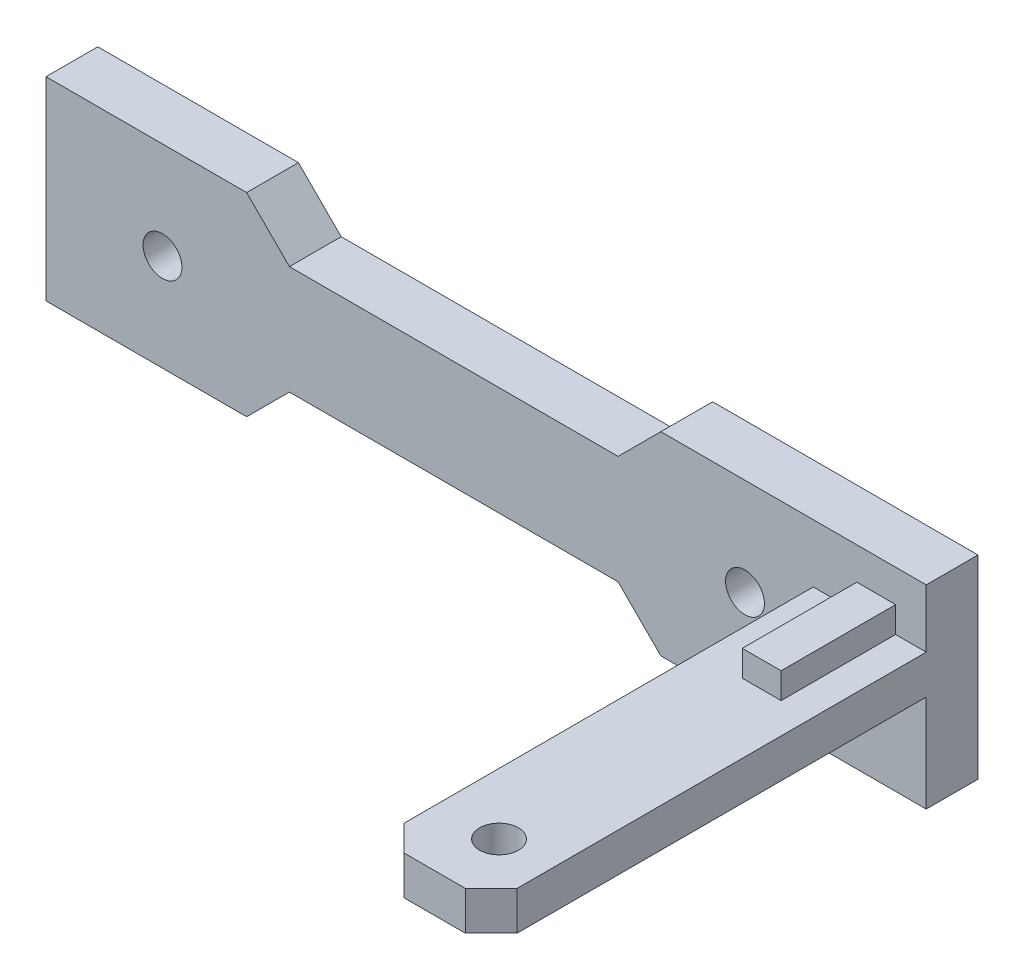
ISO-10303-21;
HEADER;
FILE_DESCRIPTION(('STEP AP214'),'2;1');
FILE_NAME('part.step','',(''),(''),'','','');
FILE_SCHEMA(('AUTOMOTIVE_DESIGN { 1 0 10303 214 1 1 1 1 }'));
ENDSEC;
DATA;
#1=APPLICATION_CONTEXT('core data for automotive mechanical design processes');
#2=APPLICATION_PROTOCOL_DEFINITION('international standard','automotive_design',2000,#1);
#3=PRODUCT_CONTEXT('',#1,'mechanical');
#4=PRODUCT('Part','Part','',(#3));
#5=PRODUCT_RELATED_PRODUCT_CATEGORY('part','',(#4));
#6=PRODUCT_DEFINITION_FORMATION('','',#4);
#7=PRODUCT_DEFINITION_CONTEXT('part definition',#1,'design');
#8=PRODUCT_DEFINITION('design','',#6,#7);
#9=PRODUCT_DEFINITION_SHAPE('','',#8);
#10=(LENGTH_UNIT() NAMED_UNIT(*) SI_UNIT(.MILLI.,.METRE.));
#11=(NAMED_UNIT(*) PLANE_ANGLE_UNIT() SI_UNIT($,.RADIAN.));
#12=(NAMED_UNIT(*) SI_UNIT($,.STERADIAN.) SOLID_ANGLE_UNIT());
#13=UNCERTAINTY_MEASURE_WITH_UNIT(LENGTH_MEASURE(1.E-05),#10,'distance_accuracy_value','');
#14=(GEOMETRIC_REPRESENTATION_CONTEXT(3) GLOBAL_UNCERTAINTY_ASSIGNED_CONTEXT((#13)) GLOBAL_UNIT_ASSIGNED_CONTEXT((#10,
#11,#12)) REPRESENTATION_CONTEXT('',''));
#15=CARTESIAN_POINT('',(0.,0.,0.));
#16=DIRECTION('',(0.,0.,1.));
#17=DIRECTION('',(1.,0.,0.));
#18=AXIS2_PLACEMENT_3D('',#15,#16,#17);
#19=CARTESIAN_POINT('',(0.,7.50106635036618,4.));
#20=DIRECTION('',(0.,-1.,0.));
#21=DIRECTION('',(1.,0.,0.));
#22=AXIS2_PLACEMENT_3D('',#19,#20,#21);
#23=PLANE('',#22);
#24=DIRECTION('',(0.,0.,1.));
#25=VECTOR('',#24,1.);
#26=CARTESIAN_POINT('',(15.9995146422342,7.50106635036618,-1.));
#27=LINE('',#26,#25);
#28=CARTESIAN_POINT('',(15.9995146422342,7.50106635036618,-1.));
#29=VERTEX_POINT('',#28);
#30=CARTESIAN_POINT('',(15.9995146422342,7.50106635036618,3.));
#31=VERTEX_POINT('',#30);
#32=EDGE_CURVE('E449',#29,#31,#27,.T.);
#33=ORIENTED_EDGE('',*,*,#32,.T.);
#34=DIRECTION('',(-1.,0.,0.));
#35=VECTOR('',#34,1.);
#36=CARTESIAN_POINT('',(36.5,7.50106635036618,3.));
#37=LINE('',#36,#35);
#38=CARTESIAN_POINT('',(36.5,7.50106635036618,3.));
#39=VERTEX_POINT('',#38);
#40=EDGE_CURVE('E385',#39,#31,#37,.T.);
#41=ORIENTED_EDGE('',*,*,#40,.F.);
#42=DIRECTION('',(0.,0.,1.));
#43=VECTOR('',#42,1.);
#44=CARTESIAN_POINT('',(36.5,7.50106635036618,0.));
#45=LINE('',#44,#43);
#46=CARTESIAN_POINT('',(36.5,7.50106635036618,-1.));
#47=VERTEX_POINT('',#46);
#48=EDGE_CURVE('E265',#47,#39,#45,.T.);
#49=ORIENTED_EDGE('',*,*,#48,.F.);
#50=DIRECTION('',(1.,0.,0.));
#51=VECTOR('',#50,1.);
#52=CARTESIAN_POINT('',(-31.5,7.50106635036618,-1.));
#53=LINE('',#52,#51);
#54=EDGE_CURVE('E249',#29,#47,#53,.T.);
#55=ORIENTED_EDGE('',*,*,#54,.F.);
#56=EDGE_LOOP('',(#33,#41,#49,#55));
#57=FACE_BOUND('',#56,.T.);
#58=ADVANCED_FACE('F43',(#57),#23,.F.);
#59=CARTESIAN_POINT('',(0.,-7.50106635036617,4.));
#60=DIRECTION('',(0.,-1.,0.));
#61=DIRECTION('',(1.,0.,0.));
#62=AXIS2_PLACEMENT_3D('',#59,#60,#61);
#63=PLANE('',#62);
#64=DIRECTION('',(-1.,0.,0.));
#65=VECTOR('',#64,1.);
#66=CARTESIAN_POINT('',(36.5,-7.50106635036617,-1.));
#67=LINE('',#66,#65);
#68=CARTESIAN_POINT('',(-15.9995146422342,-7.50106635036618,-1.));
#69=VERTEX_POINT('',#68);
#70=CARTESIAN_POINT('',(-31.5,-7.50106635036618,-1.));
#71=VERTEX_POINT('',#70);
#72=EDGE_CURVE('E420',#69,#71,#67,.T.);
#73=ORIENTED_EDGE('',*,*,#72,.F.);
#74=DIRECTION('',(0.,0.,1.));
#75=VECTOR('',#74,1.);
#76=CARTESIAN_POINT('',(-15.9995146422342,-7.50106635036618,-1.));
#77=LINE('',#76,#75);
#78=CARTESIAN_POINT('',(-15.9995146422342,-7.50106635036618,3.));
#79=VERTEX_POINT('',#78);
#80=EDGE_CURVE('E461',#69,#79,#77,.T.);
#81=ORIENTED_EDGE('',*,*,#80,.T.);
#82=DIRECTION('',(1.,0.,0.));
#83=VECTOR('',#82,1.);
#84=CARTESIAN_POINT('',(-31.5,-7.50106635036618,3.));
#85=LINE('',#84,#83);
#86=CARTESIAN_POINT('',(-31.5,-7.50106635036618,3.));
#87=VERTEX_POINT('',#86);
#88=EDGE_CURVE('E397',#87,#79,#85,.T.);
#89=ORIENTED_EDGE('',*,*,#88,.F.);
#90=DIRECTION('',(0.,0.,1.));
#91=VECTOR('',#90,1.);
#92=CARTESIAN_POINT('',(-31.5,-7.50106635036618,4.));
#93=LINE('',#92,#91);
#94=EDGE_CURVE('E284',#71,#87,#93,.T.);
#95=ORIENTED_EDGE('',*,*,#94,.F.);
#96=EDGE_LOOP('',(#73,#81,#89,#95));
#97=FACE_BOUND('',#96,.T.);
#98=ADVANCED_FACE('F436',(#97),#63,.T.);
#99=CARTESIAN_POINT('',(0.,0.,-1.));
#100=DIRECTION('',(0.,0.,-1.));
#101=DIRECTION('',(-1.,0.,0.));
#102=AXIS2_PLACEMENT_3D('',#99,#100,#101);
#103=PLANE('',#102);
#104=CARTESIAN_POINT('',(22.5,0.,-1.));
#105=DIRECTION('',(0.,0.,-1.));
#106=DIRECTION('',(-1.,0.,0.));
#107=AXIS2_PLACEMENT_3D('',#104,#105,#106);
#108=CIRCLE('',#107,1.5);
#109=CARTESIAN_POINT('',(21.,0.,-1.));
#110=VERTEX_POINT('',#109);
#111=EDGE_CURVE('E413',#110,#110,#108,.T.);
#112=ORIENTED_EDGE('',*,*,#111,.F.);
#113=EDGE_LOOP('',(#112));
#114=FACE_BOUND('',#113,.T.);
#115=CARTESIAN_POINT('',(-22.5,0.,-1.));
#116=DIRECTION('',(0.,0.,-1.));
#117=DIRECTION('',(-1.,0.,0.));
#118=AXIS2_PLACEMENT_3D('',#115,#116,#117);
#119=CIRCLE('',#118,1.5);
#120=CARTESIAN_POINT('',(-24.,0.,-1.));
#121=VERTEX_POINT('',#120);
#122=EDGE_CURVE('E409',#121,#121,#119,.T.);
#123=ORIENTED_EDGE('',*,*,#122,.F.);
#124=EDGE_LOOP('',(#123));
#125=FACE_BOUND('',#124,.T.);
#126=DIRECTION('',(-1.,0.,0.));
#127=VECTOR('',#126,1.);
#128=CARTESIAN_POINT('',(0.,4.19694569642091,-1.));
#129=LINE('',#128,#127);
#130=CARTESIAN_POINT('',(12.6953939882889,4.19694569642091,-1.));
#131=VERTEX_POINT('',#130);
#132=CARTESIAN_POINT('',(-12.6953939882889,4.1969456964209,-1.));
#133=VERTEX_POINT('',#132);
#134=EDGE_CURVE('E230',#131,#133,#129,.T.);
#135=ORIENTED_EDGE('',*,*,#134,.F.);
#136=DIRECTION('',(-0.707106781186542,-0.707106781186554,0.));
#137=VECTOR('',#136,1.);
#138=CARTESIAN_POINT('',(4.24922414593413,-4.24922414593405,-1.));
#139=LINE('',#138,#137);
#140=EDGE_CURVE('E241',#29,#131,#139,.T.);
#141=ORIENTED_EDGE('',*,*,#140,.F.);
#142=ORIENTED_EDGE('',*,*,#54,.T.);
#143=DIRECTION('',(0.,-1.,0.));
#144=VECTOR('',#143,1.);
#145=CARTESIAN_POINT('',(36.5,7.50106635036618,-1.));
#146=LINE('',#145,#144);
#147=CARTESIAN_POINT('',(36.5,-7.50106635036617,-1.));
#148=VERTEX_POINT('',#147);
#149=EDGE_CURVE('E417',#47,#148,#146,.T.);
#150=ORIENTED_EDGE('',*,*,#149,.T.);
#151=CARTESIAN_POINT('',(15.9995146422342,-7.50106635036618,-1.));
#152=VERTEX_POINT('',#151);
#153=EDGE_CURVE('E421',#148,#152,#67,.T.);
#154=ORIENTED_EDGE('',*,*,#153,.T.);
#155=DIRECTION('',(-0.707106781186542,0.707106781186554,0.));
#156=VECTOR('',#155,1.);
#157=CARTESIAN_POINT('',(4.24922414593413,4.24922414593405,-1.));
#158=LINE('',#157,#156);
#159=CARTESIAN_POINT('',(12.6953939882889,-4.19694569642091,-1.));
#160=VERTEX_POINT('',#159);
#161=EDGE_CURVE('E455',#152,#160,#158,.T.);
#162=ORIENTED_EDGE('',*,*,#161,.T.);
#163=DIRECTION('',(-1.,0.,0.));
#164=VECTOR('',#163,1.);
#165=CARTESIAN_POINT('',(0.,-4.19694569642091,-1.));
#166=LINE('',#165,#164);
#167=CARTESIAN_POINT('',(-12.6953939882889,-4.1969456964209,-1.));
#168=VERTEX_POINT('',#167);
#169=EDGE_CURVE('E458',#160,#168,#166,.T.);
#170=ORIENTED_EDGE('',*,*,#169,.T.);
#171=DIRECTION('',(0.707106781186542,0.707106781186554,0.));
#172=VECTOR('',#171,1.);
#173=CARTESIAN_POINT('',(-4.24922414593413,4.24922414593406,-1.));
#174=LINE('',#173,#172);
#175=EDGE_CURVE('E432',#69,#168,#174,.T.);
#176=ORIENTED_EDGE('',*,*,#175,.F.);
#177=ORIENTED_EDGE('',*,*,#72,.T.);
#178=DIRECTION('',(0.,1.,0.));
#179=VECTOR('',#178,1.);
#180=CARTESIAN_POINT('',(-31.5,-7.50106635036618,-1.));
#181=LINE('',#180,#179);
#182=CARTESIAN_POINT('',(-31.5,7.50106635036618,-1.));
#183=VERTEX_POINT('',#182);
#184=EDGE_CURVE('E246',#71,#183,#181,.T.);
#185=ORIENTED_EDGE('',*,*,#184,.T.);
#186=CARTESIAN_POINT('',(-15.9995146422342,7.50106635036618,-1.));
#187=VERTEX_POINT('',#186);
#188=EDGE_CURVE('E238',#183,#187,#53,.T.);
#189=ORIENTED_EDGE('',*,*,#188,.T.);
#190=DIRECTION('',(0.707106781186542,-0.707106781186554,0.));
#191=VECTOR('',#190,1.);
#192=CARTESIAN_POINT('',(-4.24922414593413,-4.24922414593406,-1.));
#193=LINE('',#192,#191);
#194=EDGE_CURVE('E219',#187,#133,#193,.T.);
#195=ORIENTED_EDGE('',*,*,#194,.T.);
#196=EDGE_LOOP('',(#135,#141,#142,#150,#154,#162,#170,#176,#177,#185,#189,#195));
#197=FACE_BOUND('',#196,.T.);
#198=ADVANCED_FACE('F244',(#114,#125,#197),#103,.T.);
#199=CARTESIAN_POINT('',(0.,0.,3.));
#200=DIRECTION('',(0.,0.,1.));
#201=DIRECTION('',(1.,0.,0.));
#202=AXIS2_PLACEMENT_3D('',#199,#200,#201);
#203=PLANE('',#202);
#204=CARTESIAN_POINT('',(22.5,0.,3.));
#205=DIRECTION('',(0.,0.,1.));
#206=DIRECTION('',(1.,0.,0.));
#207=AXIS2_PLACEMENT_3D('',#204,#205,#206);
#208=CIRCLE('',#207,1.5);
#209=CARTESIAN_POINT('',(24.,0.,3.));
#210=VERTEX_POINT('',#209);
#211=EDGE_CURVE('E405',#210,#210,#208,.T.);
#212=ORIENTED_EDGE('',*,*,#211,.F.);
#213=EDGE_LOOP('',(#212));
#214=FACE_BOUND('',#213,.T.);
#215=CARTESIAN_POINT('',(-22.5,0.,3.));
#216=DIRECTION('',(0.,0.,1.));
#217=DIRECTION('',(1.,0.,0.));
#218=AXIS2_PLACEMENT_3D('',#215,#216,#217);
#219=CIRCLE('',#218,1.5);
#220=CARTESIAN_POINT('',(-21.,0.,3.));
#221=VERTEX_POINT('',#220);
#222=EDGE_CURVE('E401',#221,#221,#219,.T.);
#223=ORIENTED_EDGE('',*,*,#222,.F.);
#224=EDGE_LOOP('',(#223));
#225=FACE_BOUND('',#224,.T.);
#226=ORIENTED_EDGE('',*,*,#40,.T.);
#227=DIRECTION('',(-0.707106781186542,-0.707106781186554,0.));
#228=VECTOR('',#227,1.);
#229=CARTESIAN_POINT('',(4.24922414593413,-4.24922414593405,3.));
#230=LINE('',#229,#228);
#231=CARTESIAN_POINT('',(12.6953939882889,4.19694569642091,3.));
#232=VERTEX_POINT('',#231);
#233=EDGE_CURVE('E325',#31,#232,#230,.T.);
#234=ORIENTED_EDGE('',*,*,#233,.T.);
#235=DIRECTION('',(-1.,0.,0.));
#236=VECTOR('',#235,1.);
#237=CARTESIAN_POINT('',(0.,4.19694569642091,3.));
#238=LINE('',#237,#236);
#239=CARTESIAN_POINT('',(-12.6953939882889,4.1969456964209,3.));
#240=VERTEX_POINT('',#239);
#241=EDGE_CURVE('E321',#232,#240,#238,.T.);
#242=ORIENTED_EDGE('',*,*,#241,.T.);
#243=DIRECTION('',(0.707106781186542,-0.707106781186554,0.));
#244=VECTOR('',#243,1.);
#245=CARTESIAN_POINT('',(-4.24922414593413,-4.24922414593406,3.));
#246=LINE('',#245,#244);
#247=CARTESIAN_POINT('',(-15.9995146422342,7.50106635036618,3.));
#248=VERTEX_POINT('',#247);
#249=EDGE_CURVE('E318',#248,#240,#246,.T.);
#250=ORIENTED_EDGE('',*,*,#249,.F.);
#251=CARTESIAN_POINT('',(-31.5,7.50106635036618,3.));
#252=VERTEX_POINT('',#251);
#253=EDGE_CURVE('E239',#248,#252,#37,.T.);
#254=ORIENTED_EDGE('',*,*,#253,.T.);
#255=DIRECTION('',(0.,-1.,0.));
#256=VECTOR('',#255,1.);
#257=CARTESIAN_POINT('',(-31.5,7.50106635036618,3.));
#258=LINE('',#257,#256);
#259=EDGE_CURVE('E393',#252,#87,#258,.T.);
#260=ORIENTED_EDGE('',*,*,#259,.T.);
#261=ORIENTED_EDGE('',*,*,#88,.T.);
#262=DIRECTION('',(0.707106781186542,0.707106781186554,0.));
#263=VECTOR('',#262,1.);
#264=CARTESIAN_POINT('',(-4.24922414593413,4.24922414593406,3.));
#265=LINE('',#264,#263);
#266=CARTESIAN_POINT('',(-12.6953939882889,-4.1969456964209,3.));
#267=VERTEX_POINT('',#266);
#268=EDGE_CURVE('E314',#79,#267,#265,.T.);
#269=ORIENTED_EDGE('',*,*,#268,.T.);
#270=DIRECTION('',(-1.,0.,0.));
#271=VECTOR('',#270,1.);
#272=CARTESIAN_POINT('',(0.,-4.19694569642091,3.));
#273=LINE('',#272,#271);
#274=CARTESIAN_POINT('',(12.6953939882889,-4.19694569642091,3.));
#275=VERTEX_POINT('',#274);
#276=EDGE_CURVE('E311',#275,#267,#273,.T.);
#277=ORIENTED_EDGE('',*,*,#276,.F.);
#278=DIRECTION('',(-0.707106781186542,0.707106781186554,0.));
#279=VECTOR('',#278,1.);
#280=CARTESIAN_POINT('',(4.24922414593413,4.24922414593405,3.));
#281=LINE('',#280,#279);
#282=CARTESIAN_POINT('',(15.9995146422342,-7.50106635036618,3.));
#283=VERTEX_POINT('',#282);
#284=EDGE_CURVE('E308',#283,#275,#281,.T.);
#285=ORIENTED_EDGE('',*,*,#284,.F.);
#286=CARTESIAN_POINT('',(36.5,-7.50106635036618,3.));
#287=VERTEX_POINT('',#286);
#288=EDGE_CURVE('E396',#283,#287,#85,.T.);
#289=ORIENTED_EDGE('',*,*,#288,.T.);
#290=DIRECTION('',(0.,1.,0.));
#291=VECTOR('',#290,1.);
#292=CARTESIAN_POINT('',(36.5,-7.50106635036618,3.));
#293=LINE('',#292,#291);
#294=CARTESIAN_POINT('',(36.5,0.,3.));
#295=VERTEX_POINT('',#294);
#296=EDGE_CURVE('E541',#287,#295,#293,.T.);
#297=ORIENTED_EDGE('',*,*,#296,.T.);
#298=DIRECTION('',(-1.,0.,0.));
#299=VECTOR('',#298,1.);
#300=CARTESIAN_POINT('',(36.5,0.,3.));
#301=LINE('',#300,#299);
#302=CARTESIAN_POINT('',(34.1370609738659,0.,3.));
#303=VERTEX_POINT('',#302);
#304=EDGE_CURVE('E546',#295,#303,#301,.T.);
#305=ORIENTED_EDGE('',*,*,#304,.T.);
#306=DIRECTION('',(0.,1.,0.));
#307=VECTOR('',#306,1.);
#308=CARTESIAN_POINT('',(34.1370609738659,0.,3.));
#309=LINE('',#308,#307);
#310=CARTESIAN_POINT('',(34.1370609738659,-2.,3.));
#311=VERTEX_POINT('',#310);
#312=EDGE_CURVE('E301',#311,#303,#309,.T.);
#313=ORIENTED_EDGE('',*,*,#312,.F.);
#314=DIRECTION('',(1.,0.,0.));
#315=VECTOR('',#314,1.);
#316=CARTESIAN_POINT('',(0.,-2.,3.));
#317=LINE('',#316,#315);
#318=CARTESIAN_POINT('',(31.1370609738659,-2.,3.));
#319=VERTEX_POINT('',#318);
#320=EDGE_CURVE('E482',#319,#311,#317,.T.);
#321=ORIENTED_EDGE('',*,*,#320,.F.);
#322=DIRECTION('',(0.,-1.,0.));
#323=VECTOR('',#322,1.);
#324=CARTESIAN_POINT('',(31.1370609738659,0.,3.));
#325=LINE('',#324,#323);
#326=CARTESIAN_POINT('',(31.1370609738659,0.,3.));
#327=VERTEX_POINT('',#326);
#328=EDGE_CURVE('E291',#327,#319,#325,.T.);
#329=ORIENTED_EDGE('',*,*,#328,.F.);
#330=CARTESIAN_POINT('',(27.7741219477318,0.,3.));
#331=VERTEX_POINT('',#330);
#332=EDGE_CURVE('E545',#327,#331,#301,.T.);
#333=ORIENTED_EDGE('',*,*,#332,.T.);
#334=DIRECTION('',(0.,1.,0.));
#335=VECTOR('',#334,1.);
#336=CARTESIAN_POINT('',(27.7741219477318,0.,3.));
#337=LINE('',#336,#335);
#338=CARTESIAN_POINT('',(27.7741219477318,3.,3.));
#339=VERTEX_POINT('',#338);
#340=EDGE_CURVE('E360',#331,#339,#337,.T.);
#341=ORIENTED_EDGE('',*,*,#340,.T.);
#342=DIRECTION('',(1.,0.,0.));
#343=VECTOR('',#342,1.);
#344=CARTESIAN_POINT('',(27.7741219477318,3.,3.));
#345=LINE('',#344,#343);
#346=CARTESIAN_POINT('',(31.1370609738659,3.,3.));
#347=VERTEX_POINT('',#346);
#348=EDGE_CURVE('E381',#339,#347,#345,.T.);
#349=ORIENTED_EDGE('',*,*,#348,.T.);
#350=DIRECTION('',(0.,-1.,0.));
#351=VECTOR('',#350,1.);
#352=CARTESIAN_POINT('',(31.1370609738659,5.,3.));
#353=LINE('',#352,#351);
#354=CARTESIAN_POINT('',(31.1370609738659,5.,3.));
#355=VERTEX_POINT('',#354);
#356=EDGE_CURVE('E517',#355,#347,#353,.T.);
#357=ORIENTED_EDGE('',*,*,#356,.F.);
#358=DIRECTION('',(1.,0.,0.));
#359=VECTOR('',#358,1.);
#360=CARTESIAN_POINT('',(0.,5.,3.));
#361=LINE('',#360,#359);
#362=CARTESIAN_POINT('',(34.1370609738659,5.,3.));
#363=VERTEX_POINT('',#362);
#364=EDGE_CURVE('E498',#355,#363,#361,.T.);
#365=ORIENTED_EDGE('',*,*,#364,.T.);
#366=DIRECTION('',(0.,-1.,0.));
#367=VECTOR('',#366,1.);
#368=CARTESIAN_POINT('',(34.1370609738659,5.,3.));
#369=LINE('',#368,#367);
#370=CARTESIAN_POINT('',(34.1370609738659,3.,3.));
#371=VERTEX_POINT('',#370);
#372=EDGE_CURVE('E513',#363,#371,#369,.T.);
#373=ORIENTED_EDGE('',*,*,#372,.T.);
#374=CARTESIAN_POINT('',(36.5,3.,3.));
#375=VERTEX_POINT('',#374);
#376=EDGE_CURVE('E388',#371,#375,#345,.T.);
#377=ORIENTED_EDGE('',*,*,#376,.T.);
#378=DIRECTION('',(0.,1.,0.));
#379=VECTOR('',#378,1.);
#380=CARTESIAN_POINT('',(36.5,3.,3.));
#381=LINE('',#380,#379);
#382=EDGE_CURVE('E374',#375,#39,#381,.T.);
#383=ORIENTED_EDGE('',*,*,#382,.T.);
#384=EDGE_LOOP('',(#226,#234,#242,#250,#254,#260,#261,#269,#277,#285,#289,#297,#305,#313,#321,
#329,#333,#341,#349,#357,#365,#373,#377,#383));
#385=FACE_BOUND('',#384,.T.);
#386=ADVANCED_FACE('F440',(#214,#225,#385),#203,.T.);
#387=ORIENTED_EDGE('',*,*,#253,.F.);
#388=DIRECTION('',(0.,0.,1.));
#389=VECTOR('',#388,1.);
#390=CARTESIAN_POINT('',(-15.9995146422342,7.50106635036618,-1.));
#391=LINE('',#390,#389);
#392=EDGE_CURVE('E222',#187,#248,#391,.T.);
#393=ORIENTED_EDGE('',*,*,#392,.F.);
#394=ORIENTED_EDGE('',*,*,#188,.F.);
#395=DIRECTION('',(0.,0.,1.));
#396=VECTOR('',#395,1.);
#397=CARTESIAN_POINT('',(-31.5,7.50106635036618,4.));
#398=LINE('',#397,#396);
#399=EDGE_CURVE('E288',#183,#252,#398,.T.);
#400=ORIENTED_EDGE('',*,*,#399,.T.);
#401=EDGE_LOOP('',(#387,#393,#394,#400));
#402=FACE_BOUND('',#401,.T.);
#403=ADVANCED_FACE('F236',(#402),#23,.F.);
#404=DIRECTION('',(0.,0.,1.));
#405=VECTOR('',#404,1.);
#406=CARTESIAN_POINT('',(15.9995146422342,-7.50106635036618,-1.));
#407=LINE('',#406,#405);
#408=EDGE_CURVE('E469',#152,#283,#407,.T.);
#409=ORIENTED_EDGE('',*,*,#408,.F.);
#410=ORIENTED_EDGE('',*,*,#153,.F.);
#411=DIRECTION('',(0.,0.,-1.));
#412=VECTOR('',#411,1.);
#413=CARTESIAN_POINT('',(36.5,-7.50106635036618,4.));
#414=LINE('',#413,#412);
#415=EDGE_CURVE('E281',#287,#148,#414,.T.);
#416=ORIENTED_EDGE('',*,*,#415,.F.);
#417=ORIENTED_EDGE('',*,*,#288,.F.);
#418=EDGE_LOOP('',(#409,#410,#416,#417));
#419=FACE_BOUND('',#418,.T.);
#420=ADVANCED_FACE('F588',(#419),#63,.T.);
#421=CARTESIAN_POINT('',(22.5,0.,4.));
#422=DIRECTION('',(0.,0.,-1.));
#423=DIRECTION('',(-1.,0.,0.));
#424=AXIS2_PLACEMENT_3D('',#421,#422,#423);
#425=CYLINDRICAL_SURFACE('',#424,1.5);
#426=ORIENTED_EDGE('',*,*,#111,.T.);
#427=EDGE_LOOP('',(#426));
#428=FACE_BOUND('',#427,.T.);
#429=ORIENTED_EDGE('',*,*,#211,.T.);
#430=EDGE_LOOP('',(#429));
#431=FACE_BOUND('',#430,.T.);
#432=ADVANCED_FACE('F595',(#428,#431),#425,.F.);
#433=CARTESIAN_POINT('',(-22.5,0.,4.));
#434=DIRECTION('',(0.,0.,-1.));
#435=DIRECTION('',(-1.,0.,0.));
#436=AXIS2_PLACEMENT_3D('',#433,#434,#435);
#437=CYLINDRICAL_SURFACE('',#436,1.5);
#438=ORIENTED_EDGE('',*,*,#122,.T.);
#439=EDGE_LOOP('',(#438));
#440=FACE_BOUND('',#439,.T.);
#441=ORIENTED_EDGE('',*,*,#222,.T.);
#442=EDGE_LOOP('',(#441));
#443=FACE_BOUND('',#442,.T.);
#444=ADVANCED_FACE('F623',(#440,#443),#437,.F.);
#445=CARTESIAN_POINT('',(-31.5,0.,0.));
#446=DIRECTION('',(1.,0.,0.));
#447=DIRECTION('',(0.,0.,-1.));
#448=AXIS2_PLACEMENT_3D('',#445,#446,#447);
#449=PLANE('',#448);
#450=ORIENTED_EDGE('',*,*,#259,.F.);
#451=ORIENTED_EDGE('',*,*,#399,.F.);
#452=ORIENTED_EDGE('',*,*,#184,.F.);
#453=ORIENTED_EDGE('',*,*,#94,.T.);
#454=EDGE_LOOP('',(#450,#451,#452,#453));
#455=FACE_BOUND('',#454,.T.);
#456=ADVANCED_FACE('F439',(#455),#449,.F.);
#457=CARTESIAN_POINT('',(36.5,0.,0.));
#458=DIRECTION('',(1.,0.,0.));
#459=DIRECTION('',(0.,0.,-1.));
#460=AXIS2_PLACEMENT_3D('',#457,#458,#459);
#461=PLANE('',#460);
#462=DIRECTION('',(0.,0.,1.));
#463=VECTOR('',#462,1.);
#464=CARTESIAN_POINT('',(36.5,3.,-5.22718525787011));
#465=LINE('',#464,#463);
#466=CARTESIAN_POINT('',(36.5,3.,34.6066176949041));
#467=VERTEX_POINT('',#466);
#468=EDGE_CURVE('E262',#375,#467,#465,.T.);
#469=ORIENTED_EDGE('',*,*,#468,.T.);
#470=DIRECTION('',(0.,-1.,0.));
#471=VECTOR('',#470,1.);
#472=CARTESIAN_POINT('',(36.5,0.,34.6066176949041));
#473=LINE('',#472,#471);
#474=CARTESIAN_POINT('',(36.5,0.,34.6066176949041));
#475=VERTEX_POINT('',#474);
#476=EDGE_CURVE('E11',#467,#475,#473,.T.);
#477=ORIENTED_EDGE('',*,*,#476,.T.);
#478=DIRECTION('',(0.,0.,1.));
#479=VECTOR('',#478,1.);
#480=CARTESIAN_POINT('',(36.5,0.,-5.22718525787011));
#481=LINE('',#480,#479);
#482=EDGE_CURVE('E266',#295,#475,#481,.T.);
#483=ORIENTED_EDGE('',*,*,#482,.F.);
#484=ORIENTED_EDGE('',*,*,#296,.F.);
#485=ORIENTED_EDGE('',*,*,#415,.T.);
#486=ORIENTED_EDGE('',*,*,#149,.F.);
#487=ORIENTED_EDGE('',*,*,#48,.T.);
#488=ORIENTED_EDGE('',*,*,#382,.F.);
#489=EDGE_LOOP('',(#469,#477,#483,#484,#485,#486,#487,#488));
#490=FACE_BOUND('',#489,.T.);
#491=ADVANCED_FACE('F373',(#490),#461,.T.);
#492=CARTESIAN_POINT('',(0.,0.,-5.22718525787011));
#493=DIRECTION('',(0.,-1.,0.));
#494=DIRECTION('',(0.,0.,-1.));
#495=AXIS2_PLACEMENT_3D('',#492,#493,#494);
#496=PLANE('',#495);
#497=DIRECTION('',(-1.,0.,0.));
#498=VECTOR('',#497,1.);
#499=CARTESIAN_POINT('',(0.,0.,36.6066176949041));
#500=LINE('',#499,#498);
#501=CARTESIAN_POINT('',(34.5,0.,36.6066176949041));
#502=VERTEX_POINT('',#501);
#503=CARTESIAN_POINT('',(29.7741219477318,0.,36.6066176949041));
#504=VERTEX_POINT('',#503);
#505=EDGE_CURVE('E254',#502,#504,#500,.T.);
#506=ORIENTED_EDGE('',*,*,#505,.T.);
#507=DIRECTION('',(0.707106781186549,0.,0.707106781186546));
#508=VECTOR('',#507,1.);
#509=CARTESIAN_POINT('',(-6.02984050252125,0.,0.802655244651163));
#510=LINE('',#509,#508);
#511=CARTESIAN_POINT('',(27.7741219477318,0.,34.6066176949041));
#512=VERTEX_POINT('',#511);
#513=EDGE_CURVE('E53',#504,#512,#510,.F.);
#514=ORIENTED_EDGE('',*,*,#513,.T.);
#515=DIRECTION('',(0.,0.,1.));
#516=VECTOR('',#515,1.);
#517=CARTESIAN_POINT('',(27.7741219477318,0.,-5.22718525787011));
#518=LINE('',#517,#516);
#519=EDGE_CURVE('E269',#331,#512,#518,.T.);
#520=ORIENTED_EDGE('',*,*,#519,.F.);
#521=ORIENTED_EDGE('',*,*,#332,.F.);
#522=DIRECTION('',(0.,0.,-1.));
#523=VECTOR('',#522,1.);
#524=CARTESIAN_POINT('',(31.1370609738659,0.,-5.22718525787011));
#525=LINE('',#524,#523);
#526=CARTESIAN_POINT('',(31.1370609738659,0.,11.8478215037108));
#527=VERTEX_POINT('',#526);
#528=EDGE_CURVE('E526',#527,#327,#525,.T.);
#529=ORIENTED_EDGE('',*,*,#528,.F.);
#530=DIRECTION('',(-1.,0.,0.));
#531=VECTOR('',#530,1.);
#532=CARTESIAN_POINT('',(0.,0.,11.8478215037108));
#533=LINE('',#532,#531);
#534=CARTESIAN_POINT('',(34.1370609738659,0.,11.8478215037108));
#535=VERTEX_POINT('',#534);
#536=EDGE_CURVE('E537',#535,#527,#533,.T.);
#537=ORIENTED_EDGE('',*,*,#536,.F.);
#538=DIRECTION('',(0.,0.,1.));
#539=VECTOR('',#538,1.);
#540=CARTESIAN_POINT('',(34.1370609738659,0.,-5.22718525787011));
#541=LINE('',#540,#539);
#542=EDGE_CURVE('E533',#303,#535,#541,.T.);
#543=ORIENTED_EDGE('',*,*,#542,.F.);
#544=ORIENTED_EDGE('',*,*,#304,.F.);
#545=ORIENTED_EDGE('',*,*,#482,.T.);
#546=DIRECTION('',(0.707106781186546,0.,-0.707106781186549));
#547=VECTOR('',#546,1.);
#548=CARTESIAN_POINT('',(38.1669014763872,0.,32.9397162185169));
#549=LINE('',#548,#547);
#550=EDGE_CURVE('E345',#475,#502,#549,.F.);
#551=ORIENTED_EDGE('',*,*,#550,.T.);
#552=EDGE_LOOP('',(#506,#514,#520,#521,#529,#537,#543,#544,#545,#551));
#553=FACE_BOUND('',#552,.T.);
#554=CARTESIAN_POINT('',(32.5,0.,32.));
#555=DIRECTION('',(0.,1.,0.));
#556=DIRECTION('',(0.,0.,1.));
#557=AXIS2_PLACEMENT_3D('',#554,#555,#556);
#558=CIRCLE('',#557,1.5);
#559=CARTESIAN_POINT('',(32.5,0.,33.5));
#560=VERTEX_POINT('',#559);
#561=EDGE_CURVE('E261',#560,#560,#558,.F.);
#562=ORIENTED_EDGE('',*,*,#561,.F.);
#563=EDGE_LOOP('',(#562));
#564=FACE_BOUND('',#563,.T.);
#565=ADVANCED_FACE('F351',(#553,#564),#496,.T.);
#566=CARTESIAN_POINT('',(0.,3.,-5.22718525787011));
#567=DIRECTION('',(0.,1.,0.));
#568=DIRECTION('',(0.,0.,1.));
#569=AXIS2_PLACEMENT_3D('',#566,#567,#568);
#570=PLANE('',#569);
#571=DIRECTION('',(0.,0.,1.));
#572=VECTOR('',#571,1.);
#573=CARTESIAN_POINT('',(27.7741219477318,3.,-5.22718525787011));
#574=LINE('',#573,#572);
#575=CARTESIAN_POINT('',(27.7741219477318,3.,34.6066176949041));
#576=VERTEX_POINT('',#575);
#577=EDGE_CURVE('E273',#339,#576,#574,.T.);
#578=ORIENTED_EDGE('',*,*,#577,.T.);
#579=DIRECTION('',(-0.707106781186549,0.,-0.707106781186546));
#580=VECTOR('',#579,1.);
#581=CARTESIAN_POINT('',(-6.02984050252125,3.,0.802655244651163));
#582=LINE('',#581,#580);
#583=CARTESIAN_POINT('',(29.7741219477318,3.,36.6066176949041));
#584=VERTEX_POINT('',#583);
#585=EDGE_CURVE('E336',#576,#584,#582,.F.);
#586=ORIENTED_EDGE('',*,*,#585,.T.);
#587=DIRECTION('',(1.,0.,0.));
#588=VECTOR('',#587,1.);
#589=CARTESIAN_POINT('',(0.,3.,36.6066176949041));
#590=LINE('',#589,#588);
#591=CARTESIAN_POINT('',(34.5,3.,36.6066176949041));
#592=VERTEX_POINT('',#591);
#593=EDGE_CURVE('E248',#584,#592,#590,.T.);
#594=ORIENTED_EDGE('',*,*,#593,.T.);
#595=DIRECTION('',(-0.707106781186546,0.,0.707106781186549));
#596=VECTOR('',#595,1.);
#597=CARTESIAN_POINT('',(38.1669014763872,3.,32.9397162185169));
#598=LINE('',#597,#596);
#599=EDGE_CURVE('E333',#592,#467,#598,.F.);
#600=ORIENTED_EDGE('',*,*,#599,.T.);
#601=ORIENTED_EDGE('',*,*,#468,.F.);
#602=ORIENTED_EDGE('',*,*,#376,.F.);
#603=DIRECTION('',(0.,0.,-1.));
#604=VECTOR('',#603,1.);
#605=CARTESIAN_POINT('',(34.1370609738659,3.,-5.22718525787011));
#606=LINE('',#605,#604);
#607=CARTESIAN_POINT('',(34.1370609738659,3.,11.8478215037108));
#608=VERTEX_POINT('',#607);
#609=EDGE_CURVE('E530',#608,#371,#606,.T.);
#610=ORIENTED_EDGE('',*,*,#609,.F.);
#611=DIRECTION('',(1.,0.,0.));
#612=VECTOR('',#611,1.);
#613=CARTESIAN_POINT('',(0.,3.,11.8478215037108));
#614=LINE('',#613,#612);
#615=CARTESIAN_POINT('',(31.1370609738659,3.,11.8478215037108));
#616=VERTEX_POINT('',#615);
#617=EDGE_CURVE('E305',#616,#608,#614,.T.);
#618=ORIENTED_EDGE('',*,*,#617,.F.);
#619=DIRECTION('',(0.,0.,1.));
#620=VECTOR('',#619,1.);
#621=CARTESIAN_POINT('',(31.1370609738659,3.,-5.22718525787011));
#622=LINE('',#621,#620);
#623=EDGE_CURVE('E511',#347,#616,#622,.T.);
#624=ORIENTED_EDGE('',*,*,#623,.F.);
#625=ORIENTED_EDGE('',*,*,#348,.F.);
#626=EDGE_LOOP('',(#578,#586,#594,#600,#601,#602,#610,#618,#624,#625));
#627=FACE_BOUND('',#626,.T.);
#628=CARTESIAN_POINT('',(32.5,3.,32.));
#629=DIRECTION('',(0.,1.,0.));
#630=DIRECTION('',(0.,0.,1.));
#631=AXIS2_PLACEMENT_3D('',#628,#629,#630);
#632=CIRCLE('',#631,1.5);
#633=CARTESIAN_POINT('',(32.5,3.,33.5));
#634=VERTEX_POINT('',#633);
#635=EDGE_CURVE('E277',#634,#634,#632,.T.);
#636=ORIENTED_EDGE('',*,*,#635,.F.);
#637=EDGE_LOOP('',(#636));
#638=FACE_BOUND('',#637,.T.);
#639=ADVANCED_FACE('F363',(#627,#638),#570,.T.);
#640=CARTESIAN_POINT('',(27.7741219477318,0.,-5.22718525787011));
#641=DIRECTION('',(-1.,0.,0.));
#642=DIRECTION('',(0.,0.,1.));
#643=AXIS2_PLACEMENT_3D('',#640,#641,#642);
#644=PLANE('',#643);
#645=ORIENTED_EDGE('',*,*,#519,.T.);
#646=DIRECTION('',(0.,1.,0.));
#647=VECTOR('',#646,1.);
#648=CARTESIAN_POINT('',(27.7741219477318,0.,34.6066176949041));
#649=LINE('',#648,#647);
#650=EDGE_CURVE('E329',#512,#576,#649,.T.);
#651=ORIENTED_EDGE('',*,*,#650,.T.);
#652=ORIENTED_EDGE('',*,*,#577,.F.);
#653=ORIENTED_EDGE('',*,*,#340,.F.);
#654=EDGE_LOOP('',(#645,#651,#652,#653));
#655=FACE_BOUND('',#654,.T.);
#656=ADVANCED_FACE('F358',(#655),#644,.T.);
#657=CARTESIAN_POINT('',(32.5,-7.50106635036618,32.));
#658=DIRECTION('',(0.,1.,0.));
#659=DIRECTION('',(0.,0.,1.));
#660=AXIS2_PLACEMENT_3D('',#657,#658,#659);
#661=CYLINDRICAL_SURFACE('',#660,1.5);
#662=ORIENTED_EDGE('',*,*,#561,.T.);
#663=EDGE_LOOP('',(#662));
#664=FACE_BOUND('',#663,.T.);
#665=ORIENTED_EDGE('',*,*,#635,.T.);
#666=EDGE_LOOP('',(#665));
#667=FACE_BOUND('',#666,.T.);
#668=ADVANCED_FACE('F609',(#664,#667),#661,.F.);
#669=CARTESIAN_POINT('',(0.,-7.50106635036618,36.6066176949041));
#670=DIRECTION('',(0.,0.,1.));
#671=DIRECTION('',(1.,0.,0.));
#672=AXIS2_PLACEMENT_3D('',#669,#670,#671);
#673=PLANE('',#672);
#674=ORIENTED_EDGE('',*,*,#593,.F.);
#675=DIRECTION('',(0.,-1.,0.));
#676=VECTOR('',#675,1.);
#677=CARTESIAN_POINT('',(29.7741219477318,-7.50106635036618,36.6066176949041));
#678=LINE('',#677,#676);
#679=EDGE_CURVE('E66',#584,#504,#678,.T.);
#680=ORIENTED_EDGE('',*,*,#679,.T.);
#681=ORIENTED_EDGE('',*,*,#505,.F.);
#682=DIRECTION('',(0.,1.,0.));
#683=VECTOR('',#682,1.);
#684=CARTESIAN_POINT('',(34.5,-7.50106635036618,36.6066176949041));
#685=LINE('',#684,#683);
#686=EDGE_CURVE('E339',#502,#592,#685,.T.);
#687=ORIENTED_EDGE('',*,*,#686,.T.);
#688=EDGE_LOOP('',(#674,#680,#681,#687));
#689=FACE_BOUND('',#688,.T.);
#690=ADVANCED_FACE('F366',(#689),#673,.T.);
#691=CARTESIAN_POINT('',(0.,-2.,0.));
#692=DIRECTION('',(0.,-1.,0.));
#693=DIRECTION('',(0.,0.,-1.));
#694=AXIS2_PLACEMENT_3D('',#691,#692,#693);
#695=PLANE('',#694);
#696=DIRECTION('',(-1.,0.,0.));
#697=VECTOR('',#696,1.);
#698=CARTESIAN_POINT('',(0.,-2.,11.8478215037108));
#699=LINE('',#698,#697);
#700=CARTESIAN_POINT('',(34.1370609738659,-2.,11.8478215037108));
#701=VERTEX_POINT('',#700);
#702=CARTESIAN_POINT('',(31.1370609738659,-2.,11.8478215037108));
#703=VERTEX_POINT('',#702);
#704=EDGE_CURVE('E474',#701,#703,#699,.T.);
#705=ORIENTED_EDGE('',*,*,#704,.T.);
#706=DIRECTION('',(0.,0.,-1.));
#707=VECTOR('',#706,1.);
#708=CARTESIAN_POINT('',(31.1370609738659,-2.,0.));
#709=LINE('',#708,#707);
#710=EDGE_CURVE('E478',#703,#319,#709,.T.);
#711=ORIENTED_EDGE('',*,*,#710,.T.);
#712=ORIENTED_EDGE('',*,*,#320,.T.);
#713=DIRECTION('',(0.,0.,1.));
#714=VECTOR('',#713,1.);
#715=CARTESIAN_POINT('',(34.1370609738659,-2.,0.));
#716=LINE('',#715,#714);
#717=EDGE_CURVE('E486',#311,#701,#716,.T.);
#718=ORIENTED_EDGE('',*,*,#717,.T.);
#719=EDGE_LOOP('',(#705,#711,#712,#718));
#720=FACE_BOUND('',#719,.T.);
#721=ADVANCED_FACE('F579',(#720),#695,.T.);
#722=CARTESIAN_POINT('',(31.1370609738659,5.,0.));
#723=DIRECTION('',(-1.,0.,0.));
#724=DIRECTION('',(0.,0.,1.));
#725=AXIS2_PLACEMENT_3D('',#722,#723,#724);
#726=PLANE('',#725);
#727=DIRECTION('',(0.,-1.,0.));
#728=VECTOR('',#727,1.);
#729=CARTESIAN_POINT('',(31.1370609738659,5.,11.8478215037108));
#730=LINE('',#729,#728);
#731=EDGE_CURVE('E506',#527,#703,#730,.T.);
#732=ORIENTED_EDGE('',*,*,#731,.F.);
#733=ORIENTED_EDGE('',*,*,#528,.T.);
#734=ORIENTED_EDGE('',*,*,#328,.T.);
#735=ORIENTED_EDGE('',*,*,#710,.F.);
#736=EDGE_LOOP('',(#732,#733,#734,#735));
#737=FACE_BOUND('',#736,.T.);
#738=ADVANCED_FACE('F568',(#737),#726,.T.);
#739=CARTESIAN_POINT('',(34.1370609738659,5.,0.));
#740=DIRECTION('',(1.,0.,0.));
#741=DIRECTION('',(0.,0.,-1.));
#742=AXIS2_PLACEMENT_3D('',#739,#740,#741);
#743=PLANE('',#742);
#744=ORIENTED_EDGE('',*,*,#312,.T.);
#745=ORIENTED_EDGE('',*,*,#542,.T.);
#746=DIRECTION('',(0.,-1.,0.));
#747=VECTOR('',#746,1.);
#748=CARTESIAN_POINT('',(34.1370609738659,5.,11.8478215037108));
#749=LINE('',#748,#747);
#750=EDGE_CURVE('E512',#535,#701,#749,.T.);
#751=ORIENTED_EDGE('',*,*,#750,.T.);
#752=ORIENTED_EDGE('',*,*,#717,.F.);
#753=EDGE_LOOP('',(#744,#745,#751,#752));
#754=FACE_BOUND('',#753,.T.);
#755=ADVANCED_FACE('F576',(#754),#743,.T.);
#756=CARTESIAN_POINT('',(0.,5.,11.8478215037108));
#757=DIRECTION('',(0.,0.,1.));
#758=DIRECTION('',(1.,0.,0.));
#759=AXIS2_PLACEMENT_3D('',#756,#757,#758);
#760=PLANE('',#759);
#761=ORIENTED_EDGE('',*,*,#750,.F.);
#762=ORIENTED_EDGE('',*,*,#536,.T.);
#763=ORIENTED_EDGE('',*,*,#731,.T.);
#764=ORIENTED_EDGE('',*,*,#704,.F.);
#765=EDGE_LOOP('',(#761,#762,#763,#764));
#766=FACE_BOUND('',#765,.T.);
#767=ADVANCED_FACE('F690',(#766),#760,.T.);
#768=CARTESIAN_POINT('',(31.1370609738659,5.,11.8478215037108));
#769=VERTEX_POINT('',#768);
#770=EDGE_CURVE('E520',#769,#616,#730,.T.);
#771=ORIENTED_EDGE('',*,*,#770,.T.);
#772=ORIENTED_EDGE('',*,*,#617,.T.);
#773=CARTESIAN_POINT('',(34.1370609738659,5.,11.8478215037108));
#774=VERTEX_POINT('',#773);
#775=EDGE_CURVE('E507',#774,#608,#749,.T.);
#776=ORIENTED_EDGE('',*,*,#775,.F.);
#777=DIRECTION('',(-1.,0.,0.));
#778=VECTOR('',#777,1.);
#779=CARTESIAN_POINT('',(0.,5.,11.8478215037108));
#780=LINE('',#779,#778);
#781=EDGE_CURVE('E490',#774,#769,#780,.T.);
#782=ORIENTED_EDGE('',*,*,#781,.T.);
#783=EDGE_LOOP('',(#771,#772,#776,#782));
#784=FACE_BOUND('',#783,.T.);
#785=ADVANCED_FACE('F559',(#784),#760,.T.);
#786=ORIENTED_EDGE('',*,*,#775,.T.);
#787=ORIENTED_EDGE('',*,*,#609,.T.);
#788=ORIENTED_EDGE('',*,*,#372,.F.);
#789=DIRECTION('',(0.,0.,1.));
#790=VECTOR('',#789,1.);
#791=CARTESIAN_POINT('',(34.1370609738659,5.,0.));
#792=LINE('',#791,#790);
#793=EDGE_CURVE('E502',#363,#774,#792,.T.);
#794=ORIENTED_EDGE('',*,*,#793,.T.);
#795=EDGE_LOOP('',(#786,#787,#788,#794));
#796=FACE_BOUND('',#795,.T.);
#797=ADVANCED_FACE('F556',(#796),#743,.T.);
#798=ORIENTED_EDGE('',*,*,#356,.T.);
#799=ORIENTED_EDGE('',*,*,#623,.T.);
#800=ORIENTED_EDGE('',*,*,#770,.F.);
#801=DIRECTION('',(0.,0.,-1.));
#802=VECTOR('',#801,1.);
#803=CARTESIAN_POINT('',(31.1370609738659,5.,0.));
#804=LINE('',#803,#802);
#805=EDGE_CURVE('E494',#769,#355,#804,.T.);
#806=ORIENTED_EDGE('',*,*,#805,.T.);
#807=EDGE_LOOP('',(#798,#799,#800,#806));
#808=FACE_BOUND('',#807,.T.);
#809=ADVANCED_FACE('F565',(#808),#726,.T.);
#810=CARTESIAN_POINT('',(0.,5.,0.));
#811=DIRECTION('',(0.,-1.,0.));
#812=DIRECTION('',(0.,0.,-1.));
#813=AXIS2_PLACEMENT_3D('',#810,#811,#812);
#814=PLANE('',#813);
#815=ORIENTED_EDGE('',*,*,#781,.F.);
#816=ORIENTED_EDGE('',*,*,#793,.F.);
#817=ORIENTED_EDGE('',*,*,#364,.F.);
#818=ORIENTED_EDGE('',*,*,#805,.F.);
#819=EDGE_LOOP('',(#815,#816,#817,#818));
#820=FACE_BOUND('',#819,.T.);
#821=ADVANCED_FACE('F562',(#820),#814,.F.);
#822=CARTESIAN_POINT('',(-4.24922414593413,4.24922414593406,-1.));
#823=DIRECTION('',(0.707106781186554,-0.707106781186542,0.));
#824=DIRECTION('',(0.707106781186542,0.707106781186554,0.));
#825=AXIS2_PLACEMENT_3D('',#822,#823,#824);
#826=PLANE('',#825);
#827=ORIENTED_EDGE('',*,*,#80,.F.);
#828=ORIENTED_EDGE('',*,*,#175,.T.);
#829=DIRECTION('',(0.,0.,1.));
#830=VECTOR('',#829,1.);
#831=CARTESIAN_POINT('',(-12.6953939882889,-4.1969456964209,-1.));
#832=LINE('',#831,#830);
#833=EDGE_CURVE('E231',#168,#267,#832,.T.);
#834=ORIENTED_EDGE('',*,*,#833,.T.);
#835=ORIENTED_EDGE('',*,*,#268,.F.);
#836=EDGE_LOOP('',(#827,#828,#834,#835));
#837=FACE_BOUND('',#836,.T.);
#838=ADVANCED_FACE('F573',(#837),#826,.T.);
#839=CARTESIAN_POINT('',(0.,-4.19694569642091,-1.));
#840=DIRECTION('',(0.,1.,0.));
#841=DIRECTION('',(-1.,0.,0.));
#842=AXIS2_PLACEMENT_3D('',#839,#840,#841);
#843=PLANE('',#842);
#844=ORIENTED_EDGE('',*,*,#276,.T.);
#845=ORIENTED_EDGE('',*,*,#833,.F.);
#846=ORIENTED_EDGE('',*,*,#169,.F.);
#847=DIRECTION('',(0.,0.,1.));
#848=VECTOR('',#847,1.);
#849=CARTESIAN_POINT('',(12.6953939882889,-4.19694569642091,-1.));
#850=LINE('',#849,#848);
#851=EDGE_CURVE('E465',#160,#275,#850,.T.);
#852=ORIENTED_EDGE('',*,*,#851,.T.);
#853=EDGE_LOOP('',(#844,#845,#846,#852));
#854=FACE_BOUND('',#853,.T.);
#855=ADVANCED_FACE('F760',(#854),#843,.F.);
#856=CARTESIAN_POINT('',(4.24922414593413,4.24922414593405,-1.));
#857=DIRECTION('',(0.707106781186554,0.707106781186542,0.));
#858=DIRECTION('',(-0.707106781186542,0.707106781186554,0.));
#859=AXIS2_PLACEMENT_3D('',#856,#857,#858);
#860=PLANE('',#859);
#861=ORIENTED_EDGE('',*,*,#284,.T.);
#862=ORIENTED_EDGE('',*,*,#851,.F.);
#863=ORIENTED_EDGE('',*,*,#161,.F.);
#864=ORIENTED_EDGE('',*,*,#408,.T.);
#865=EDGE_LOOP('',(#861,#862,#863,#864));
#866=FACE_BOUND('',#865,.T.);
#867=ADVANCED_FACE('F770',(#866),#860,.F.);
#868=CARTESIAN_POINT('',(4.24922414593413,-4.24922414593405,-1.));
#869=DIRECTION('',(-0.707106781186554,0.707106781186542,0.));
#870=DIRECTION('',(-0.707106781186542,-0.707106781186554,0.));
#871=AXIS2_PLACEMENT_3D('',#868,#869,#870);
#872=PLANE('',#871);
#873=ORIENTED_EDGE('',*,*,#32,.F.);
#874=ORIENTED_EDGE('',*,*,#140,.T.);
#875=DIRECTION('',(0.,0.,1.));
#876=VECTOR('',#875,1.);
#877=CARTESIAN_POINT('',(12.6953939882889,4.19694569642091,-1.));
#878=LINE('',#877,#876);
#879=EDGE_CURVE('E446',#131,#232,#878,.T.);
#880=ORIENTED_EDGE('',*,*,#879,.T.);
#881=ORIENTED_EDGE('',*,*,#233,.F.);
#882=EDGE_LOOP('',(#873,#874,#880,#881));
#883=FACE_BOUND('',#882,.T.);
#884=ADVANCED_FACE('F780',(#883),#872,.T.);
#885=CARTESIAN_POINT('',(0.,4.19694569642091,-1.));
#886=DIRECTION('',(0.,1.,0.));
#887=DIRECTION('',(-1.,0.,0.));
#888=AXIS2_PLACEMENT_3D('',#885,#886,#887);
#889=PLANE('',#888);
#890=ORIENTED_EDGE('',*,*,#879,.F.);
#891=ORIENTED_EDGE('',*,*,#134,.T.);
#892=DIRECTION('',(0.,0.,1.));
#893=VECTOR('',#892,1.);
#894=CARTESIAN_POINT('',(-12.6953939882889,4.1969456964209,-1.));
#895=LINE('',#894,#893);
#896=EDGE_CURVE('E225',#133,#240,#895,.T.);
#897=ORIENTED_EDGE('',*,*,#896,.T.);
#898=ORIENTED_EDGE('',*,*,#241,.F.);
#899=EDGE_LOOP('',(#890,#891,#897,#898));
#900=FACE_BOUND('',#899,.T.);
#901=ADVANCED_FACE('F443',(#900),#889,.T.);
#902=CARTESIAN_POINT('',(-4.24922414593413,-4.24922414593406,-1.));
#903=DIRECTION('',(-0.707106781186554,-0.707106781186542,0.));
#904=DIRECTION('',(0.707106781186542,-0.707106781186554,0.));
#905=AXIS2_PLACEMENT_3D('',#902,#903,#904);
#906=PLANE('',#905);
#907=ORIENTED_EDGE('',*,*,#249,.T.);
#908=ORIENTED_EDGE('',*,*,#896,.F.);
#909=ORIENTED_EDGE('',*,*,#194,.F.);
#910=ORIENTED_EDGE('',*,*,#392,.T.);
#911=EDGE_LOOP('',(#907,#908,#909,#910));
#912=FACE_BOUND('',#911,.T.);
#913=ADVANCED_FACE('F221',(#912),#906,.F.);
#914=CARTESIAN_POINT('',(27.7741219477318,0.,34.6066176949041));
#915=DIRECTION('',(0.707106781186546,0.,-0.707106781186549));
#916=DIRECTION('',(0.,1.,0.));
#917=AXIS2_PLACEMENT_3D('',#914,#915,#916);
#918=PLANE('',#917);
#919=ORIENTED_EDGE('',*,*,#513,.F.);
#920=ORIENTED_EDGE('',*,*,#679,.F.);
#921=ORIENTED_EDGE('',*,*,#585,.F.);
#922=ORIENTED_EDGE('',*,*,#650,.F.);
#923=EDGE_LOOP('',(#919,#920,#921,#922));
#924=FACE_BOUND('',#923,.T.);
#925=ADVANCED_FACE('F361',(#924),#918,.F.);
#926=CARTESIAN_POINT('',(34.5,-7.50106635036618,36.6066176949041));
#927=DIRECTION('',(-0.707106781186549,0.,-0.707106781186546));
#928=DIRECTION('',(0.,1.,0.));
#929=AXIS2_PLACEMENT_3D('',#926,#927,#928);
#930=PLANE('',#929);
#931=ORIENTED_EDGE('',*,*,#550,.F.);
#932=ORIENTED_EDGE('',*,*,#476,.F.);
#933=ORIENTED_EDGE('',*,*,#599,.F.);
#934=ORIENTED_EDGE('',*,*,#686,.F.);
#935=EDGE_LOOP('',(#931,#932,#933,#934));
#936=FACE_BOUND('',#935,.T.);
#937=ADVANCED_FACE('F46',(#936),#930,.F.);
#938=CLOSED_SHELL('',(#58,#98,#198,#386,#403,#420,#432,#444,#456,#491,#565,#639,#656,#668,#690,
#721,#738,#755,#767,#785,#797,#809,#821,#838,#855,#867,#884,#901,#913,#925,#937));
#939=MANIFOLD_SOLID_BREP('B2',#938);
#940=ADVANCED_BREP_SHAPE_REPRESENTATION('',(#18,#939),#14);
#941=SHAPE_DEFINITION_REPRESENTATION(#9,#940);
ENDSEC;
END-ISO-10303-21;
